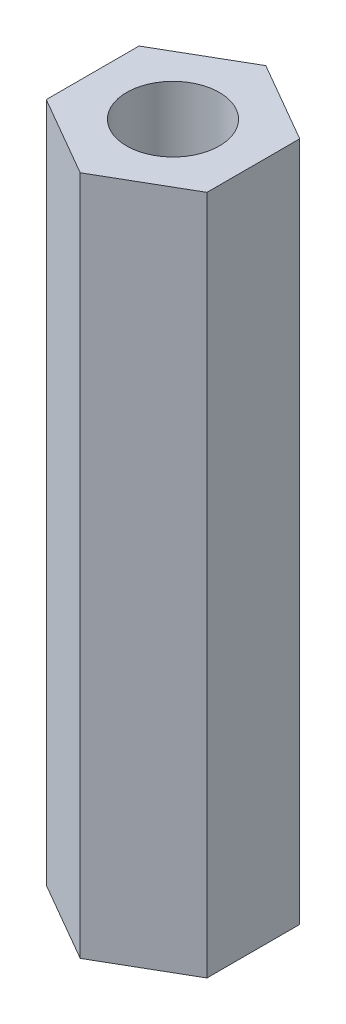
ISO-10303-21;
HEADER;
FILE_DESCRIPTION(('STEP AP214'),'2;1');
FILE_NAME('part.step','',(''),(''),'','','');
FILE_SCHEMA(('AUTOMOTIVE_DESIGN { 1 0 10303 214 1 1 1 1 }'));
ENDSEC;
DATA;
#1=APPLICATION_CONTEXT('core data for automotive mechanical design processes');
#2=APPLICATION_PROTOCOL_DEFINITION('international standard','automotive_design',2000,#1);
#3=PRODUCT_CONTEXT('',#1,'mechanical');
#4=PRODUCT('Part','Part','',(#3));
#5=PRODUCT_RELATED_PRODUCT_CATEGORY('part','',(#4));
#6=PRODUCT_DEFINITION_FORMATION('','',#4);
#7=PRODUCT_DEFINITION_CONTEXT('part definition',#1,'design');
#8=PRODUCT_DEFINITION('design','',#6,#7);
#9=PRODUCT_DEFINITION_SHAPE('','',#8);
#10=(LENGTH_UNIT() NAMED_UNIT(*) SI_UNIT(.MILLI.,.METRE.));
#11=(NAMED_UNIT(*) PLANE_ANGLE_UNIT() SI_UNIT($,.RADIAN.));
#12=(NAMED_UNIT(*) SI_UNIT($,.STERADIAN.) SOLID_ANGLE_UNIT());
#13=UNCERTAINTY_MEASURE_WITH_UNIT(LENGTH_MEASURE(1.E-05),#10,'distance_accuracy_value','');
#14=(GEOMETRIC_REPRESENTATION_CONTEXT(3) GLOBAL_UNCERTAINTY_ASSIGNED_CONTEXT((#13)) GLOBAL_UNIT_ASSIGNED_CONTEXT((#10,
#11,#12)) REPRESENTATION_CONTEXT('',''));
#15=CARTESIAN_POINT('',(0.,0.,0.));
#16=DIRECTION('',(0.,0.,1.));
#17=DIRECTION('',(1.,0.,0.));
#18=AXIS2_PLACEMENT_3D('',#15,#16,#17);
#19=CARTESIAN_POINT('',(-1.29903810567666,22.,2.25));
#20=DIRECTION('',(0.5,0.,-0.866025403784439));
#21=DIRECTION('',(-0.866025403784439,0.,-0.5));
#22=AXIS2_PLACEMENT_3D('',#19,#20,#21);
#23=PLANE('',#22);
#24=DIRECTION('',(0.866025403784439,0.,0.5));
#25=VECTOR('',#24,1.);
#26=CARTESIAN_POINT('',(-1.29903810567666,0.,2.25));
#27=LINE('',#26,#25);
#28=CARTESIAN_POINT('',(-2.59807621135332,0.,1.5));
#29=VERTEX_POINT('',#28);
#30=CARTESIAN_POINT('',(0.,0.,3.));
#31=VERTEX_POINT('',#30);
#32=EDGE_CURVE('E133',#29,#31,#27,.T.);
#33=ORIENTED_EDGE('',*,*,#32,.T.);
#34=DIRECTION('',(0.,-1.,0.));
#35=VECTOR('',#34,1.);
#36=CARTESIAN_POINT('',(0.,22.,3.));
#37=LINE('',#36,#35);
#38=CARTESIAN_POINT('',(0.,22.,3.));
#39=VERTEX_POINT('',#38);
#40=EDGE_CURVE('E11',#39,#31,#37,.T.);
#41=ORIENTED_EDGE('',*,*,#40,.F.);
#42=DIRECTION('',(0.866025403784439,0.,0.5));
#43=VECTOR('',#42,1.);
#44=CARTESIAN_POINT('',(-1.29903810567666,22.,2.25));
#45=LINE('',#44,#43);
#46=CARTESIAN_POINT('',(-2.59807621135332,22.,1.5));
#47=VERTEX_POINT('',#46);
#48=EDGE_CURVE('E169',#47,#39,#45,.T.);
#49=ORIENTED_EDGE('',*,*,#48,.F.);
#50=DIRECTION('',(0.,-1.,0.));
#51=VECTOR('',#50,1.);
#52=CARTESIAN_POINT('',(-2.59807621135332,22.,1.5));
#53=LINE('',#52,#51);
#54=EDGE_CURVE('E125',#47,#29,#53,.T.);
#55=ORIENTED_EDGE('',*,*,#54,.T.);
#56=EDGE_LOOP('',(#33,#41,#49,#55));
#57=FACE_BOUND('',#56,.T.);
#58=ADVANCED_FACE('F41',(#57),#23,.F.);
#59=CARTESIAN_POINT('',(1.29903810567666,22.,2.25));
#60=DIRECTION('',(-0.5,0.,-0.866025403784439));
#61=DIRECTION('',(-0.866025403784439,0.,0.5));
#62=AXIS2_PLACEMENT_3D('',#59,#60,#61);
#63=PLANE('',#62);
#64=DIRECTION('',(0.866025403784439,0.,-0.5));
#65=VECTOR('',#64,1.);
#66=CARTESIAN_POINT('',(1.29903810567666,0.,2.25));
#67=LINE('',#66,#65);
#68=CARTESIAN_POINT('',(2.59807621135332,0.,1.5));
#69=VERTEX_POINT('',#68);
#70=EDGE_CURVE('E137',#31,#69,#67,.T.);
#71=ORIENTED_EDGE('',*,*,#70,.T.);
#72=DIRECTION('',(0.,-1.,0.));
#73=VECTOR('',#72,1.);
#74=CARTESIAN_POINT('',(2.59807621135332,22.,1.5));
#75=LINE('',#74,#73);
#76=CARTESIAN_POINT('',(2.59807621135332,22.,1.5));
#77=VERTEX_POINT('',#76);
#78=EDGE_CURVE('E51',#77,#69,#75,.T.);
#79=ORIENTED_EDGE('',*,*,#78,.F.);
#80=DIRECTION('',(0.866025403784439,0.,-0.5));
#81=VECTOR('',#80,1.);
#82=CARTESIAN_POINT('',(1.29903810567666,22.,2.25));
#83=LINE('',#82,#81);
#84=EDGE_CURVE('E92',#39,#77,#83,.T.);
#85=ORIENTED_EDGE('',*,*,#84,.F.);
#86=ORIENTED_EDGE('',*,*,#40,.T.);
#87=EDGE_LOOP('',(#71,#79,#85,#86));
#88=FACE_BOUND('',#87,.T.);
#89=ADVANCED_FACE('F162',(#88),#63,.F.);
#90=CARTESIAN_POINT('',(2.59807621135332,22.,0.));
#91=DIRECTION('',(1.,0.,0.));
#92=DIRECTION('',(0.,0.,-1.));
#93=AXIS2_PLACEMENT_3D('',#90,#91,#92);
#94=PLANE('',#93);
#95=DIRECTION('',(0.,0.,1.));
#96=VECTOR('',#95,1.);
#97=CARTESIAN_POINT('',(2.59807621135332,0.,0.));
#98=LINE('',#97,#96);
#99=CARTESIAN_POINT('',(2.59807621135332,0.,-1.5));
#100=VERTEX_POINT('',#99);
#101=EDGE_CURVE('E141',#100,#69,#98,.T.);
#102=ORIENTED_EDGE('',*,*,#101,.F.);
#103=DIRECTION('',(0.,-1.,0.));
#104=VECTOR('',#103,1.);
#105=CARTESIAN_POINT('',(2.59807621135332,22.,-1.5));
#106=LINE('',#105,#104);
#107=CARTESIAN_POINT('',(2.59807621135332,22.,-1.5));
#108=VERTEX_POINT('',#107);
#109=EDGE_CURVE('E119',#108,#100,#106,.T.);
#110=ORIENTED_EDGE('',*,*,#109,.F.);
#111=DIRECTION('',(0.,0.,1.));
#112=VECTOR('',#111,1.);
#113=CARTESIAN_POINT('',(2.59807621135332,22.,0.));
#114=LINE('',#113,#112);
#115=EDGE_CURVE('E106',#108,#77,#114,.T.);
#116=ORIENTED_EDGE('',*,*,#115,.T.);
#117=ORIENTED_EDGE('',*,*,#78,.T.);
#118=EDGE_LOOP('',(#102,#110,#116,#117));
#119=FACE_BOUND('',#118,.T.);
#120=ADVANCED_FACE('F161',(#119),#94,.T.);
#121=CARTESIAN_POINT('',(1.29903810567666,22.,-2.25));
#122=DIRECTION('',(-0.5,0.,0.866025403784439));
#123=DIRECTION('',(0.866025403784439,0.,0.5));
#124=AXIS2_PLACEMENT_3D('',#121,#122,#123);
#125=PLANE('',#124);
#126=DIRECTION('',(-0.866025403784439,0.,-0.5));
#127=VECTOR('',#126,1.);
#128=CARTESIAN_POINT('',(1.29903810567666,0.,-2.25));
#129=LINE('',#128,#127);
#130=CARTESIAN_POINT('',(0.,0.,-3.));
#131=VERTEX_POINT('',#130);
#132=EDGE_CURVE('E114',#100,#131,#129,.T.);
#133=ORIENTED_EDGE('',*,*,#132,.T.);
#134=DIRECTION('',(0.,-1.,0.));
#135=VECTOR('',#134,1.);
#136=CARTESIAN_POINT('',(0.,22.,-3.));
#137=LINE('',#136,#135);
#138=CARTESIAN_POINT('',(0.,22.,-3.));
#139=VERTEX_POINT('',#138);
#140=EDGE_CURVE('E111',#139,#131,#137,.T.);
#141=ORIENTED_EDGE('',*,*,#140,.F.);
#142=DIRECTION('',(-0.866025403784439,0.,-0.5));
#143=VECTOR('',#142,1.);
#144=CARTESIAN_POINT('',(1.29903810567666,22.,-2.25));
#145=LINE('',#144,#143);
#146=EDGE_CURVE('E100',#108,#139,#145,.T.);
#147=ORIENTED_EDGE('',*,*,#146,.F.);
#148=ORIENTED_EDGE('',*,*,#109,.T.);
#149=EDGE_LOOP('',(#133,#141,#147,#148));
#150=FACE_BOUND('',#149,.T.);
#151=ADVANCED_FACE('F112',(#150),#125,.F.);
#152=CARTESIAN_POINT('',(-1.29903810567666,22.,-2.25));
#153=DIRECTION('',(-0.5,0.,-0.866025403784439));
#154=DIRECTION('',(-0.866025403784439,0.,0.5));
#155=AXIS2_PLACEMENT_3D('',#152,#153,#154);
#156=PLANE('',#155);
#157=DIRECTION('',(0.866025403784439,0.,-0.5));
#158=VECTOR('',#157,1.);
#159=CARTESIAN_POINT('',(-1.29903810567666,0.,-2.25));
#160=LINE('',#159,#158);
#161=CARTESIAN_POINT('',(-2.59807621135332,0.,-1.5));
#162=VERTEX_POINT('',#161);
#163=EDGE_CURVE('E147',#162,#131,#160,.T.);
#164=ORIENTED_EDGE('',*,*,#163,.F.);
#165=DIRECTION('',(0.,-1.,0.));
#166=VECTOR('',#165,1.);
#167=CARTESIAN_POINT('',(-2.59807621135332,22.,-1.5));
#168=LINE('',#167,#166);
#169=CARTESIAN_POINT('',(-2.59807621135332,22.,-1.5));
#170=VERTEX_POINT('',#169);
#171=EDGE_CURVE('E81',#170,#162,#168,.T.);
#172=ORIENTED_EDGE('',*,*,#171,.F.);
#173=DIRECTION('',(0.866025403784439,0.,-0.5));
#174=VECTOR('',#173,1.);
#175=CARTESIAN_POINT('',(-1.29903810567666,22.,-2.25));
#176=LINE('',#175,#174);
#177=EDGE_CURVE('E104',#170,#139,#176,.T.);
#178=ORIENTED_EDGE('',*,*,#177,.T.);
#179=ORIENTED_EDGE('',*,*,#140,.T.);
#180=EDGE_LOOP('',(#164,#172,#178,#179));
#181=FACE_BOUND('',#180,.T.);
#182=ADVANCED_FACE('F121',(#181),#156,.T.);
#183=CARTESIAN_POINT('',(0.,22.,0.));
#184=DIRECTION('',(0.,-1.,0.));
#185=DIRECTION('',(0.,0.,-1.));
#186=AXIS2_PLACEMENT_3D('',#183,#184,#185);
#187=CYLINDRICAL_SURFACE('',#186,1.5);
#188=CARTESIAN_POINT('',(0.,22.,0.));
#189=DIRECTION('',(0.,1.,0.));
#190=DIRECTION('',(0.,0.,1.));
#191=AXIS2_PLACEMENT_3D('',#188,#189,#190);
#192=CIRCLE('',#191,1.5);
#193=CARTESIAN_POINT('',(0.,22.,1.5));
#194=VERTEX_POINT('',#193);
#195=EDGE_CURVE('E152',#194,#194,#192,.T.);
#196=ORIENTED_EDGE('',*,*,#195,.T.);
#197=EDGE_LOOP('',(#196));
#198=FACE_BOUND('',#197,.T.);
#199=CARTESIAN_POINT('',(0.,0.,0.));
#200=DIRECTION('',(0.,1.,0.));
#201=DIRECTION('',(0.,0.,1.));
#202=AXIS2_PLACEMENT_3D('',#199,#200,#201);
#203=CIRCLE('',#202,1.5);
#204=CARTESIAN_POINT('',(0.,0.,1.5));
#205=VERTEX_POINT('',#204);
#206=EDGE_CURVE('E129',#205,#205,#203,.T.);
#207=ORIENTED_EDGE('',*,*,#206,.F.);
#208=EDGE_LOOP('',(#207));
#209=FACE_BOUND('',#208,.T.);
#210=ADVANCED_FACE('F43',(#198,#209),#187,.F.);
#211=CARTESIAN_POINT('',(-2.59807621135332,22.,0.));
#212=DIRECTION('',(1.,0.,0.));
#213=DIRECTION('',(0.,0.,-1.));
#214=AXIS2_PLACEMENT_3D('',#211,#212,#213);
#215=PLANE('',#214);
#216=DIRECTION('',(0.,0.,1.));
#217=VECTOR('',#216,1.);
#218=CARTESIAN_POINT('',(-2.59807621135332,0.,0.));
#219=LINE('',#218,#217);
#220=EDGE_CURVE('E84',#162,#29,#219,.T.);
#221=ORIENTED_EDGE('',*,*,#220,.T.);
#222=ORIENTED_EDGE('',*,*,#54,.F.);
#223=DIRECTION('',(0.,0.,1.));
#224=VECTOR('',#223,1.);
#225=CARTESIAN_POINT('',(-2.59807621135332,22.,0.));
#226=LINE('',#225,#224);
#227=EDGE_CURVE('E59',#170,#47,#226,.T.);
#228=ORIENTED_EDGE('',*,*,#227,.F.);
#229=ORIENTED_EDGE('',*,*,#171,.T.);
#230=EDGE_LOOP('',(#221,#222,#228,#229));
#231=FACE_BOUND('',#230,.T.);
#232=ADVANCED_FACE('F170',(#231),#215,.F.);
#233=CARTESIAN_POINT('',(0.,22.,0.));
#234=DIRECTION('',(0.,1.,0.));
#235=DIRECTION('',(0.,0.,1.));
#236=AXIS2_PLACEMENT_3D('',#233,#234,#235);
#237=PLANE('',#236);
#238=ORIENTED_EDGE('',*,*,#195,.F.);
#239=EDGE_LOOP('',(#238));
#240=FACE_BOUND('',#239,.T.);
#241=ORIENTED_EDGE('',*,*,#48,.T.);
#242=ORIENTED_EDGE('',*,*,#84,.T.);
#243=ORIENTED_EDGE('',*,*,#115,.F.);
#244=ORIENTED_EDGE('',*,*,#146,.T.);
#245=ORIENTED_EDGE('',*,*,#177,.F.);
#246=ORIENTED_EDGE('',*,*,#227,.T.);
#247=EDGE_LOOP('',(#241,#242,#243,#244,#245,#246));
#248=FACE_BOUND('',#247,.T.);
#249=ADVANCED_FACE('F102',(#240,#248),#237,.T.);
#250=CARTESIAN_POINT('',(0.,0.,0.));
#251=DIRECTION('',(0.,1.,0.));
#252=DIRECTION('',(0.,0.,1.));
#253=AXIS2_PLACEMENT_3D('',#250,#251,#252);
#254=PLANE('',#253);
#255=ORIENTED_EDGE('',*,*,#206,.T.);
#256=EDGE_LOOP('',(#255));
#257=FACE_BOUND('',#256,.T.);
#258=ORIENTED_EDGE('',*,*,#32,.F.);
#259=ORIENTED_EDGE('',*,*,#220,.F.);
#260=ORIENTED_EDGE('',*,*,#163,.T.);
#261=ORIENTED_EDGE('',*,*,#132,.F.);
#262=ORIENTED_EDGE('',*,*,#101,.T.);
#263=ORIENTED_EDGE('',*,*,#70,.F.);
#264=EDGE_LOOP('',(#258,#259,#260,#261,#262,#263));
#265=FACE_BOUND('',#264,.T.);
#266=ADVANCED_FACE('F166',(#257,#265),#254,.F.);
#267=CLOSED_SHELL('',(#58,#89,#120,#151,#182,#210,#232,#249,#266));
#268=MANIFOLD_SOLID_BREP('B2',#267);
#269=ADVANCED_BREP_SHAPE_REPRESENTATION('',(#18,#268),#14);
#270=SHAPE_DEFINITION_REPRESENTATION(#9,#269);
ENDSEC;
END-ISO-10303-21;
